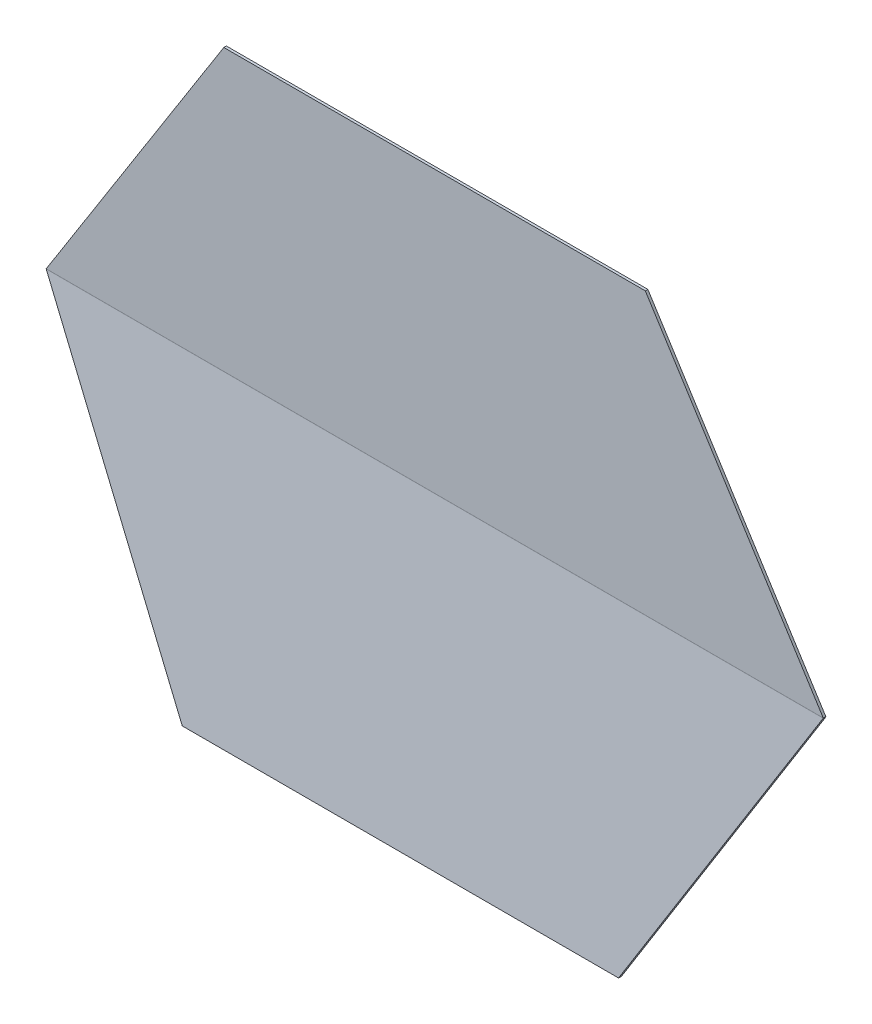
ISO-10303-21;
HEADER;
FILE_DESCRIPTION(('STEP AP214'),'2;1');
FILE_NAME('part.step','',(''),(''),'','','');
FILE_SCHEMA(('AUTOMOTIVE_DESIGN { 1 0 10303 214 1 1 1 1 }'));
ENDSEC;
DATA;
#1=APPLICATION_CONTEXT('core data for automotive mechanical design processes');
#2=APPLICATION_PROTOCOL_DEFINITION('international standard','automotive_design',2000,#1);
#3=PRODUCT_CONTEXT('',#1,'mechanical');
#4=PRODUCT('Part','Part','',(#3));
#5=PRODUCT_RELATED_PRODUCT_CATEGORY('part','',(#4));
#6=PRODUCT_DEFINITION_FORMATION('','',#4);
#7=PRODUCT_DEFINITION_CONTEXT('part definition',#1,'design');
#8=PRODUCT_DEFINITION('design','',#6,#7);
#9=PRODUCT_DEFINITION_SHAPE('','',#8);
#10=(LENGTH_UNIT() NAMED_UNIT(*) SI_UNIT(.MILLI.,.METRE.));
#11=(NAMED_UNIT(*) PLANE_ANGLE_UNIT() SI_UNIT($,.RADIAN.));
#12=(NAMED_UNIT(*) SI_UNIT($,.STERADIAN.) SOLID_ANGLE_UNIT());
#13=UNCERTAINTY_MEASURE_WITH_UNIT(LENGTH_MEASURE(1.E-05),#10,'distance_accuracy_value','');
#14=(GEOMETRIC_REPRESENTATION_CONTEXT(3) GLOBAL_UNCERTAINTY_ASSIGNED_CONTEXT((#13)) GLOBAL_UNIT_ASSIGNED_CONTEXT((#10,
#11,#12)) REPRESENTATION_CONTEXT('',''));
#15=CARTESIAN_POINT('',(0.,0.,0.));
#16=DIRECTION('',(0.,0.,1.));
#17=DIRECTION('',(1.,0.,0.));
#18=AXIS2_PLACEMENT_3D('',#15,#16,#17);
#19=CARTESIAN_POINT('',(0.0004041609394678,0.595540338395725,10.1778937181817));
#20=DIRECTION('',(7.91780855342487E-05,0.1166707102324,0.993170649538486));
#21=DIRECTION('',(0.999999996854675,-4.63470775884719E-06,-7.91780855342487E-05));
#22=AXIS2_PLACEMENT_3D('',#19,#20,#21);
#23=PLANE('',#22);
#24=DIRECTION('',(0.500004012201997,-0.86011333287123,0.101000209896064));
#25=VECTOR('',#24,1.);
#26=CARTESIAN_POINT('',(-289.380355220738,103.550819568525,-1.89349898860749));
#27=LINE('',#26,#25);
#28=CARTESIAN_POINT('',(-289.323398178921,103.452841332607,-1.88199373457318));
#29=VERTEX_POINT('',#28);
#30=CARTESIAN_POINT('',(-162.297482260204,-115.05877304566,23.7770887066437));
#31=VERTEX_POINT('',#30);
#32=EDGE_CURVE('E128',#29,#31,#27,.T.);
#33=ORIENTED_EDGE('',*,*,#32,.F.);
#34=DIRECTION('',(0.99999976972003,-0.000678645627025191,0.));
#35=VECTOR('',#34,1.);
#36=CARTESIAN_POINT('',(0.0700745514546838,103.256445672623,-1.88199373457316));
#37=LINE('',#36,#35);
#38=CARTESIAN_POINT('',(289.572156424681,103.059976305502,-1.88199373457316));
#39=VERTEX_POINT('',#38);
#40=EDGE_CURVE('E119',#29,#39,#37,.T.);
#41=ORIENTED_EDGE('',*,*,#40,.T.);
#42=DIRECTION('',(0.49999598465268,0.860108698163472,-0.101079387981598));
#43=VECTOR('',#42,1.);
#44=CARTESIAN_POINT('',(162.700943957801,-115.18784315471,23.7663412566442));
#45=LINE('',#44,#43);
#46=CARTESIAN_POINT('',(162.700943957801,-115.18784315471,23.7663412566442));
#47=VERTEX_POINT('',#46);
#48=EDGE_CURVE('E141',#47,#39,#45,.T.);
#49=ORIENTED_EDGE('',*,*,#48,.F.);
#50=DIRECTION('',(0.999999920592847,-0.000397140688658457,-3.3069234430395E-05));
#51=VECTOR('',#50,1.);
#52=CARTESIAN_POINT('',(162.700943957801,-115.18784315471,23.7663412566442));
#53=LINE('',#52,#51);
#54=EDGE_CURVE('E118',#31,#47,#53,.T.);
#55=ORIENTED_EDGE('',*,*,#54,.F.);
#56=EDGE_LOOP('',(#33,#41,#49,#55));
#57=FACE_BOUND('',#56,.T.);
#58=ADVANCED_FACE('F73',(#57),#23,.F.);
#59=CARTESIAN_POINT('',(162.700943957801,-115.18784315471,23.7663412566442));
#60=DIRECTION('',(0.866027718414386,-0.496589340116565,0.0582667848827042));
#61=DIRECTION('',(0.49999598465268,0.860108698163472,-0.101079387981598));
#62=AXIS2_PLACEMENT_3D('',#59,#60,#61);
#63=PLANE('',#62);
#64=CARTESIAN_POINT('',(289.572306863043,103.281650654943,0.00503049954995289));
#65=CARTESIAN_POINT('',(289.572156424681,103.059976305502,-1.88199373457317));
#66=B_SPLINE_CURVE_WITH_KNOTS('',1,(#64,#65),.UNSPECIFIED.,.F.,.F.,(2,2),(0.,1.),.UNSPECIFIED.);
#67=CARTESIAN_POINT('',(289.572306863044,103.281650654943,0.00503049954995278));
#68=VERTEX_POINT('',#67);
#69=EDGE_CURVE('E12',#68,#39,#66,.T.);
#70=ORIENTED_EDGE('',*,*,#69,.F.);
#71=DIRECTION('',(0.49999598465268,0.860108698163472,-0.101079387981598));
#72=VECTOR('',#71,1.);
#73=CARTESIAN_POINT('',(162.701094396164,-114.966168805269,25.6533654907673));
#74=LINE('',#73,#72);
#75=CARTESIAN_POINT('',(162.701094396164,-114.966168805269,25.6533654907673));
#76=VERTEX_POINT('',#75);
#77=EDGE_CURVE('E124',#76,#68,#74,.T.);
#78=ORIENTED_EDGE('',*,*,#77,.F.);
#79=DIRECTION('',(7.91780855342487E-05,0.1166707102324,0.993170649538486));
#80=VECTOR('',#79,1.);
#81=CARTESIAN_POINT('',(162.700943957801,-115.18784315471,23.7663412566442));
#82=LINE('',#81,#80);
#83=EDGE_CURVE('E100',#47,#76,#82,.T.);
#84=ORIENTED_EDGE('',*,*,#83,.F.);
#85=ORIENTED_EDGE('',*,*,#48,.T.);
#86=EDGE_LOOP('',(#70,#78,#84,#85));
#87=FACE_BOUND('',#86,.T.);
#88=ADVANCED_FACE('F75',(#87),#63,.T.);
#89=CARTESIAN_POINT('',(162.700943957801,-115.18784315471,23.7663412566442));
#90=DIRECTION('',(-0.000390570264645245,-0.99317057329199,0.11667073241275));
#91=DIRECTION('',(0.999999920592847,-0.000397140688658457,-3.3069234430395E-05));
#92=AXIS2_PLACEMENT_3D('',#89,#90,#91);
#93=PLANE('',#92);
#94=DIRECTION('',(0.999999920592847,-0.000397140688658457,-3.3069234430395E-05));
#95=VECTOR('',#94,1.);
#96=CARTESIAN_POINT('',(162.701094396164,-114.966168805269,25.6533654907673));
#97=LINE('',#96,#95);
#98=CARTESIAN_POINT('',(-162.297331821841,-114.837098696219,25.6641129407668));
#99=VERTEX_POINT('',#98);
#100=EDGE_CURVE('E116',#99,#76,#97,.T.);
#101=ORIENTED_EDGE('',*,*,#100,.F.);
#102=DIRECTION('',(7.91780855342487E-05,0.1166707102324,0.993170649538486));
#103=VECTOR('',#102,1.);
#104=CARTESIAN_POINT('',(-162.297482260204,-115.05877304566,23.7770887066437));
#105=LINE('',#104,#103);
#106=EDGE_CURVE('E120',#31,#99,#105,.T.);
#107=ORIENTED_EDGE('',*,*,#106,.F.);
#108=ORIENTED_EDGE('',*,*,#54,.T.);
#109=ORIENTED_EDGE('',*,*,#83,.T.);
#110=EDGE_LOOP('',(#101,#107,#108,#109));
#111=FACE_BOUND('',#110,.T.);
#112=ADVANCED_FACE('F113',(#111),#93,.T.);
#113=CARTESIAN_POINT('',(-289.380355220738,103.550819568525,-1.89349898860749));
#114=DIRECTION('',(-0.866023083706628,-0.496581312567248,0.0584039253496956));
#115=DIRECTION('',(0.500004012201997,-0.860113332871231,0.101000209896064));
#116=AXIS2_PLACEMENT_3D('',#113,#114,#115);
#117=PLANE('',#116);
#118=CARTESIAN_POINT('',(-289.323398178921,103.452841332607,-1.88199373457318));
#119=CARTESIAN_POINT('',(-289.323247740559,103.674515682048,0.00503049954995007));
#120=B_SPLINE_CURVE_WITH_KNOTS('',1,(#118,#119),.UNSPECIFIED.,.F.,.F.,(2,2),(0.,1.),.UNSPECIFIED.);
#121=CARTESIAN_POINT('',(-289.323247740559,103.674515682048,0.00503049954994996));
#122=VERTEX_POINT('',#121);
#123=EDGE_CURVE('E144',#29,#122,#120,.T.);
#124=ORIENTED_EDGE('',*,*,#123,.F.);
#125=ORIENTED_EDGE('',*,*,#32,.T.);
#126=ORIENTED_EDGE('',*,*,#106,.T.);
#127=DIRECTION('',(0.500004012201997,-0.86011333287123,0.101000209896064));
#128=VECTOR('',#127,1.);
#129=CARTESIAN_POINT('',(-289.380204782376,103.772493917967,-0.00647475448436324));
#130=LINE('',#129,#128);
#131=EDGE_CURVE('E132',#122,#99,#130,.T.);
#132=ORIENTED_EDGE('',*,*,#131,.F.);
#133=EDGE_LOOP('',(#124,#125,#126,#132));
#134=FACE_BOUND('',#133,.T.);
#135=ADVANCED_FACE('F162',(#134),#117,.T.);
#136=CARTESIAN_POINT('',(0.000554599301982872,0.817214687837284,12.0649179523048));
#137=DIRECTION('',(7.91780855342487E-05,0.1166707102324,0.993170649538486));
#138=DIRECTION('',(0.999999996854675,-4.63470775884719E-06,-7.91780855342487E-05));
#139=AXIS2_PLACEMENT_3D('',#136,#137,#138);
#140=PLANE('',#139);
#141=DIRECTION('',(0.99999976972003,-0.000678645627025191,0.));
#142=VECTOR('',#141,1.);
#143=CARTESIAN_POINT('',(0.0702249898171989,103.478120022064,0.00503049954996178));
#144=LINE('',#143,#142);
#145=EDGE_CURVE('E84',#122,#68,#144,.T.);
#146=ORIENTED_EDGE('',*,*,#145,.F.);
#147=ORIENTED_EDGE('',*,*,#131,.T.);
#148=ORIENTED_EDGE('',*,*,#100,.T.);
#149=ORIENTED_EDGE('',*,*,#77,.T.);
#150=EDGE_LOOP('',(#146,#147,#148,#149));
#151=FACE_BOUND('',#150,.T.);
#152=ADVANCED_FACE('F130',(#151),#140,.T.);
#153=CARTESIAN_POINT('',(-156.989471165865,312.7,-1.9));
#154=DIRECTION('',(0.,1.,0.));
#155=DIRECTION('',(0.,0.,1.));
#156=AXIS2_PLACEMENT_3D('',#153,#154,#155);
#157=PLANE('',#156);
#158=DIRECTION('',(-1.,0.,0.));
#159=VECTOR('',#158,1.);
#160=CARTESIAN_POINT('',(-156.989471165865,312.7,0.));
#161=LINE('',#160,#159);
#162=CARTESIAN_POINT('',(156.989471165865,312.7,0.));
#163=VERTEX_POINT('',#162);
#164=CARTESIAN_POINT('',(-156.989471165865,312.7,0.));
#165=VERTEX_POINT('',#164);
#166=EDGE_CURVE('E591',#163,#165,#161,.T.);
#167=ORIENTED_EDGE('',*,*,#166,.F.);
#168=DIRECTION('',(0.,0.,1.));
#169=VECTOR('',#168,1.);
#170=CARTESIAN_POINT('',(156.989471165865,312.7,-1.9));
#171=LINE('',#170,#169);
#172=CARTESIAN_POINT('',(156.989471165865,312.7,-1.9));
#173=VERTEX_POINT('',#172);
#174=EDGE_CURVE('E135',#173,#163,#171,.T.);
#175=ORIENTED_EDGE('',*,*,#174,.F.);
#176=DIRECTION('',(-1.,0.,0.));
#177=VECTOR('',#176,1.);
#178=CARTESIAN_POINT('',(-156.989471165865,312.7,-1.9));
#179=LINE('',#178,#177);
#180=CARTESIAN_POINT('',(-156.989471165865,312.7,-1.9));
#181=VERTEX_POINT('',#180);
#182=EDGE_CURVE('E344',#173,#181,#179,.T.);
#183=ORIENTED_EDGE('',*,*,#182,.T.);
#184=DIRECTION('',(0.,0.,1.));
#185=VECTOR('',#184,1.);
#186=CARTESIAN_POINT('',(-156.989471165865,312.7,-1.9));
#187=LINE('',#186,#185);
#188=EDGE_CURVE('E387',#181,#165,#187,.T.);
#189=ORIENTED_EDGE('',*,*,#188,.T.);
#190=EDGE_LOOP('',(#167,#175,#183,#189));
#191=FACE_BOUND('',#190,.T.);
#192=ADVANCED_FACE('F173',(#191),#157,.T.);
#193=CARTESIAN_POINT('',(0.,0.,-1.9));
#194=DIRECTION('',(0.,0.,1.));
#195=DIRECTION('',(1.,0.,0.));
#196=AXIS2_PLACEMENT_3D('',#193,#194,#195);
#197=PLANE('',#196);
#198=DIRECTION('',(0.99999976972003,-0.000678645627025023,0.));
#199=VECTOR('',#198,1.);
#200=CARTESIAN_POINT('',(0.0702833123949575,103.564059667222,-1.9));
#201=LINE('',#200,#199);
#202=CARTESIAN_POINT('',(-289.317851752811,103.760451704822,-1.9));
#203=VERTEX_POINT('',#202);
#204=CARTESIAN_POINT('',(289.566661524316,103.367594170866,-1.9));
#205=VERTEX_POINT('',#204);
#206=EDGE_CURVE('E341',#203,#205,#201,.T.);
#207=ORIENTED_EDGE('',*,*,#206,.F.);
#208=DIRECTION('',(-0.535052081184343,-0.84481907555423,0.));
#209=VECTOR('',#208,1.);
#210=CARTESIAN_POINT('',(-289.380279849348,103.661881026078,-1.9));
#211=LINE('',#210,#209);
#212=EDGE_CURVE('E374',#181,#203,#211,.T.);
#213=ORIENTED_EDGE('',*,*,#212,.F.);
#214=ORIENTED_EDGE('',*,*,#182,.F.);
#215=DIRECTION('',(-0.535052081184344,0.844819075554229,0.));
#216=VECTOR('',#215,1.);
#217=CARTESIAN_POINT('',(156.989471165865,312.7,-1.9));
#218=LINE('',#217,#216);
#219=EDGE_CURVE('E377',#205,#173,#218,.T.);
#220=ORIENTED_EDGE('',*,*,#219,.F.);
#221=EDGE_LOOP('',(#207,#213,#214,#220));
#222=FACE_BOUND('',#221,.T.);
#223=ADVANCED_FACE('F177',(#222),#197,.F.);
#224=CARTESIAN_POINT('',(-289.380279849348,103.661881026078,-1.9));
#225=DIRECTION('',(-0.84481907555423,0.535052081184343,0.));
#226=DIRECTION('',(-0.535052081184343,-0.84481907555423,0.));
#227=AXIS2_PLACEMENT_3D('',#224,#225,#226);
#228=PLANE('',#227);
#229=ORIENTED_EDGE('',*,*,#212,.T.);
#230=CARTESIAN_POINT('',(-289.317851752811,103.760451704822,0.));
#231=CARTESIAN_POINT('',(-289.317851752811,103.760451704822,-1.9));
#232=B_SPLINE_CURVE_WITH_KNOTS('',1,(#230,#231),.UNSPECIFIED.,.F.,.F.,(2,2),(0.,1.),.UNSPECIFIED.);
#233=CARTESIAN_POINT('',(-289.317851752811,103.760451704822,0.));
#234=VERTEX_POINT('',#233);
#235=EDGE_CURVE('E384',#203,#234,#232,.F.);
#236=ORIENTED_EDGE('',*,*,#235,.T.);
#237=DIRECTION('',(-0.535052081184343,-0.84481907555423,0.));
#238=VECTOR('',#237,1.);
#239=CARTESIAN_POINT('',(-289.380279849348,103.661881026078,0.));
#240=LINE('',#239,#238);
#241=EDGE_CURVE('E389',#165,#234,#240,.T.);
#242=ORIENTED_EDGE('',*,*,#241,.F.);
#243=ORIENTED_EDGE('',*,*,#188,.F.);
#244=EDGE_LOOP('',(#229,#236,#242,#243));
#245=FACE_BOUND('',#244,.T.);
#246=ADVANCED_FACE('F382',(#245),#228,.T.);
#247=CARTESIAN_POINT('',(0.,0.,0.));
#248=DIRECTION('',(0.,0.,1.));
#249=DIRECTION('',(1.,0.,0.));
#250=AXIS2_PLACEMENT_3D('',#247,#248,#249);
#251=PLANE('',#250);
#252=ORIENTED_EDGE('',*,*,#241,.T.);
#253=DIRECTION('',(0.99999976972003,-0.000678645627025023,0.));
#254=VECTOR('',#253,1.);
#255=CARTESIAN_POINT('',(0.0702833123949575,103.564059667222,0.));
#256=LINE('',#255,#254);
#257=CARTESIAN_POINT('',(289.566661524316,103.367594170866,0.));
#258=VERTEX_POINT('',#257);
#259=EDGE_CURVE('E594',#234,#258,#256,.T.);
#260=ORIENTED_EDGE('',*,*,#259,.T.);
#261=DIRECTION('',(-0.535052081184344,0.844819075554229,0.));
#262=VECTOR('',#261,1.);
#263=CARTESIAN_POINT('',(156.989471165865,312.7,0.));
#264=LINE('',#263,#262);
#265=EDGE_CURVE('E408',#258,#163,#264,.T.);
#266=ORIENTED_EDGE('',*,*,#265,.T.);
#267=ORIENTED_EDGE('',*,*,#166,.T.);
#268=EDGE_LOOP('',(#252,#260,#266,#267));
#269=FACE_BOUND('',#268,.T.);
#270=ADVANCED_FACE('F417',(#269),#251,.T.);
#271=CARTESIAN_POINT('',(156.989471165865,312.7,-1.9));
#272=DIRECTION('',(0.844819075554229,0.535052081184344,0.));
#273=DIRECTION('',(-0.535052081184344,0.844819075554229,0.));
#274=AXIS2_PLACEMENT_3D('',#271,#272,#273);
#275=PLANE('',#274);
#276=ORIENTED_EDGE('',*,*,#265,.F.);
#277=CARTESIAN_POINT('',(289.566661524316,103.367594170866,-1.9));
#278=CARTESIAN_POINT('',(289.566661524316,103.367594170866,0.));
#279=B_SPLINE_CURVE_WITH_KNOTS('',1,(#277,#278),.UNSPECIFIED.,.F.,.F.,(2,2),(0.,1.),.UNSPECIFIED.);
#280=EDGE_CURVE('E397',#258,#205,#279,.F.);
#281=ORIENTED_EDGE('',*,*,#280,.T.);
#282=ORIENTED_EDGE('',*,*,#219,.T.);
#283=ORIENTED_EDGE('',*,*,#174,.T.);
#284=EDGE_LOOP('',(#276,#281,#282,#283));
#285=FACE_BOUND('',#284,.T.);
#286=ADVANCED_FACE('F294',(#285),#275,.T.);
#287=CARTESIAN_POINT('',(-289.380317485192,103.606423753757,-1.89549458422144));
#288=CARTESIAN_POINT('',(-289.359495607728,103.657707884316,-1.89849733994322));
#289=CARTESIAN_POINT('',(-289.338673689866,103.70907976591,-1.9));
#290=CARTESIAN_POINT('',(-289.317851752811,103.760451704822,-1.9));
#291=CARTESIAN_POINT('',(-289.380242137257,103.717450650974,0.00125870031953594));
#292=CARTESIAN_POINT('',(-289.359445351132,103.731767983881,0.000419805742691216));
#293=CARTESIAN_POINT('',(-289.338648555583,103.746109840465,0.));
#294=CARTESIAN_POINT('',(-289.317851752811,103.760451704822,0.));
#295=B_SPLINE_SURFACE_WITH_KNOTS('',1,3,((#287,#288,#289,#290),(#291,#292,#293,#294)),
.UNSPECIFIED.,.F.,.F.,.F.,(2,2),(4,4),(0.,1.),(0.,1.),.UNSPECIFIED.);
#296=CARTESIAN_POINT('',(-289.380242137257,103.717450650974,0.00125870031953594));
#297=CARTESIAN_POINT('',(-289.380317485192,103.606423753757,-1.89549458422144));
#298=B_SPLINE_CURVE_WITH_KNOTS('',1,(#296,#297),.UNSPECIFIED.,.F.,.F.,(2,2),(0.,1.),.UNSPECIFIED.);
#299=CARTESIAN_POINT('',(-289.380242137257,103.717450650974,0.00125870031953594));
#300=VERTEX_POINT('',#299);
#301=CARTESIAN_POINT('',(-289.380317485192,103.606423753757,-1.89549458422144));
#302=VERTEX_POINT('',#301);
#303=EDGE_CURVE('E323',#300,#302,#298,.T.);
#304=CARTESIAN_POINT('',(-289.380242137257,103.717450650974,0.00125870031953594));
#305=CARTESIAN_POINT('',(-289.359445351132,103.731767983881,0.000419805742691216));
#306=CARTESIAN_POINT('',(-289.338648555583,103.746109840465,0.));
#307=CARTESIAN_POINT('',(-289.317851752811,103.760451704822,0.));
#308=B_SPLINE_CURVE_WITH_KNOTS('',3,(#304,#305,#306,#307),.UNSPECIFIED.,.F.,.F.,(4,4),(0.,1.),.UNSPECIFIED.);
#309=EDGE_CURVE('E222',#300,#234,#308,.T.);
#310=CARTESIAN_POINT('',(-289.317851752811,103.760451704822,-1.9));
#311=CARTESIAN_POINT('',(-289.338673689866,103.70907976591,-1.9));
#312=CARTESIAN_POINT('',(-289.359495607728,103.657707884316,-1.89849733994322));
#313=CARTESIAN_POINT('',(-289.380317485192,103.606423753757,-1.89549458422144));
#314=B_SPLINE_CURVE_WITH_KNOTS('',3,(#310,#311,#312,#313),.UNSPECIFIED.,.F.,.F.,(4,4),(0.,1.),.UNSPECIFIED.);
#315=EDGE_CURVE('E224',#302,#203,#314,.F.);
#316=ORIENTED_EDGE('',*,*,#303,.F.);
#317=ORIENTED_EDGE('',*,*,#309,.T.);
#318=ORIENTED_EDGE('',*,*,#235,.F.);
#319=ORIENTED_EDGE('',*,*,#315,.F.);
#320=EDGE_LOOP('',(#316,#317,#318,#319));
#321=FACE_BOUND('',#320,.T.);
#322=ADVANCED_FACE('F282',(#321),#295,.T.);
#323=CARTESIAN_POINT('',(289.566661524316,103.367594170866,-1.9));
#324=CARTESIAN_POINT('',(289.587476226866,103.316193975438,-1.9));
#325=CARTESIAN_POINT('',(289.608290910259,103.264793837313,-1.89849733994244));
#326=CARTESIAN_POINT('',(289.6291056724,103.213481450238,-1.89549458422143));
#327=CARTESIAN_POINT('',(289.566661524316,103.367594170866,0.));
#328=CARTESIAN_POINT('',(289.587501353175,103.353224049992,0.));
#329=CARTESIAN_POINT('',(289.608341174828,103.33885393688,0.000419805743087268));
#330=CARTESIAN_POINT('',(289.629181020335,103.324508347455,0.00125870031953703));
#331=B_SPLINE_SURFACE_WITH_KNOTS('',1,3,((#323,#324,#325,#326),(#327,#328,#329,#330)),
.UNSPECIFIED.,.F.,.F.,.F.,(2,2),(4,4),(0.,1.),(0.,1.),.UNSPECIFIED.);
#332=CARTESIAN_POINT('',(289.566661524316,103.367594170866,0.));
#333=CARTESIAN_POINT('',(289.587501353175,103.353224049992,0.));
#334=CARTESIAN_POINT('',(289.608341174828,103.33885393688,0.000419805743087268));
#335=CARTESIAN_POINT('',(289.629181020335,103.324508347455,0.00125870031953703));
#336=B_SPLINE_CURVE_WITH_KNOTS('',3,(#332,#333,#334,#335),.UNSPECIFIED.,.F.,.F.,(4,4),(0.,1.),.UNSPECIFIED.);
#337=CARTESIAN_POINT('',(289.629181020335,103.324508347455,0.00125870031953725));
#338=VERTEX_POINT('',#337);
#339=EDGE_CURVE('E549',#258,#338,#336,.T.);
#340=CARTESIAN_POINT('',(289.629181020335,103.324508347455,0.00125870031953703));
#341=CARTESIAN_POINT('',(289.6291056724,103.213481450238,-1.89549458422143));
#342=B_SPLINE_CURVE_WITH_KNOTS('',1,(#340,#341),.UNSPECIFIED.,.F.,.F.,(2,2),(0.,1.),.UNSPECIFIED.);
#343=CARTESIAN_POINT('',(289.6291056724,103.213481450238,-1.89549458422143));
#344=VERTEX_POINT('',#343);
#345=EDGE_CURVE('E342',#338,#344,#342,.T.);
#346=CARTESIAN_POINT('',(289.6291056724,103.213481450238,-1.89549458422143));
#347=CARTESIAN_POINT('',(289.608290910259,103.264793837313,-1.89849733994244));
#348=CARTESIAN_POINT('',(289.587476226866,103.316193975438,-1.9));
#349=CARTESIAN_POINT('',(289.566661524316,103.367594170866,-1.9));
#350=B_SPLINE_CURVE_WITH_KNOTS('',3,(#346,#347,#348,#349),.UNSPECIFIED.,.F.,.F.,(4,4),(0.,1.),.UNSPECIFIED.);
#351=EDGE_CURVE('E356',#205,#344,#350,.F.);
#352=ORIENTED_EDGE('',*,*,#280,.F.);
#353=ORIENTED_EDGE('',*,*,#339,.T.);
#354=ORIENTED_EDGE('',*,*,#345,.T.);
#355=ORIENTED_EDGE('',*,*,#351,.F.);
#356=EDGE_LOOP('',(#352,#353,#354,#355));
#357=FACE_BOUND('',#356,.T.);
#358=ADVANCED_FACE('F293',(#357),#331,.T.);
#359=CARTESIAN_POINT('',(289.6291056724,103.213481450238,-1.89549458422143));
#360=CARTESIAN_POINT('',(289.610122504466,103.162196071464,-1.8924918284773));
#361=CARTESIAN_POINT('',(289.591139414046,103.110998559309,-1.88798898385775));
#362=CARTESIAN_POINT('',(289.572156424681,103.059976305502,-1.88199373457317));
#363=CARTESIAN_POINT('',(289.629181020335,103.324508347455,0.00125870031953725));
#364=CARTESIAN_POINT('',(289.610222943248,103.310189766502,0.00209759490890152));
#365=CARTESIAN_POINT('',(289.591264890243,103.295895725385,0.00335557737337068));
#366=CARTESIAN_POINT('',(289.572306863043,103.281650654943,0.00503049954995289));
#367=B_SPLINE_SURFACE_WITH_KNOTS('',1,3,((#359,#360,#361,#362),(#363,#364,#365,#366)),
.UNSPECIFIED.,.F.,.F.,.F.,(2,2),(4,4),(0.,1.),(0.,1.),.UNSPECIFIED.);
#368=CARTESIAN_POINT('',(289.629181020335,103.324508347455,0.00125870031953725));
#369=CARTESIAN_POINT('',(289.610222943248,103.310189766502,0.00209759490890152));
#370=CARTESIAN_POINT('',(289.591264890243,103.295895725385,0.00335557737337068));
#371=CARTESIAN_POINT('',(289.572306863043,103.281650654943,0.00503049954995289));
#372=B_SPLINE_CURVE_WITH_KNOTS('',3,(#368,#369,#370,#371),.UNSPECIFIED.,.F.,.F.,(4,4),(0.,1.),.UNSPECIFIED.);
#373=EDGE_CURVE('E225',#338,#68,#372,.T.);
#374=CARTESIAN_POINT('',(289.572156424681,103.059976305502,-1.88199373457317));
#375=CARTESIAN_POINT('',(289.591139414046,103.110998559309,-1.88798898385775));
#376=CARTESIAN_POINT('',(289.610122504466,103.162196071464,-1.8924918284773));
#377=CARTESIAN_POINT('',(289.6291056724,103.213481450238,-1.89549458422143));
#378=B_SPLINE_CURVE_WITH_KNOTS('',3,(#374,#375,#376,#377),.UNSPECIFIED.,.F.,.F.,(4,4),(0.,1.),.UNSPECIFIED.);
#379=EDGE_CURVE('E91',#344,#39,#378,.F.);
#380=ORIENTED_EDGE('',*,*,#345,.F.);
#381=ORIENTED_EDGE('',*,*,#373,.T.);
#382=ORIENTED_EDGE('',*,*,#69,.T.);
#383=ORIENTED_EDGE('',*,*,#379,.F.);
#384=EDGE_LOOP('',(#380,#381,#382,#383));
#385=FACE_BOUND('',#384,.T.);
#386=ADVANCED_FACE('F245',(#385),#367,.T.);
#387=CARTESIAN_POINT('',(-289.323398178921,103.452841332607,-1.88199373457318));
#388=CARTESIAN_POINT('',(-289.342371386156,103.503889345215,-1.88798898385632));
#389=CARTESIAN_POINT('',(-289.361344456526,103.555112616183,-1.89249182847803));
#390=CARTESIAN_POINT('',(-289.380317485192,103.606423753757,-1.89549458422144));
#391=CARTESIAN_POINT('',(-289.323247740559,103.674515682048,0.00503049954995007));
#392=CARTESIAN_POINT('',(-289.342245902972,103.688786511291,0.0033555773742632));
#393=CARTESIAN_POINT('',(-289.361244024731,103.70310631122,0.00209759490845635));
#394=CARTESIAN_POINT('',(-289.380242137257,103.717450650974,0.00125870031953594));
#395=B_SPLINE_SURFACE_WITH_KNOTS('',1,3,((#387,#388,#389,#390),(#391,#392,#393,#394)),
.UNSPECIFIED.,.F.,.F.,.F.,(2,2),(4,4),(0.,1.),(0.,1.),.UNSPECIFIED.);
#396=CARTESIAN_POINT('',(-289.323247740559,103.674515682048,0.00503049954995007));
#397=CARTESIAN_POINT('',(-289.342245902972,103.688786511291,0.0033555773742632));
#398=CARTESIAN_POINT('',(-289.361244024731,103.70310631122,0.00209759490845635));
#399=CARTESIAN_POINT('',(-289.380242137257,103.717450650974,0.00125870031953594));
#400=B_SPLINE_CURVE_WITH_KNOTS('',3,(#396,#397,#398,#399),.UNSPECIFIED.,.F.,.F.,(4,4),(0.,1.),.UNSPECIFIED.);
#401=EDGE_CURVE('E210',#122,#300,#400,.T.);
#402=CARTESIAN_POINT('',(-289.380317485192,103.606423753757,-1.89549458422144));
#403=CARTESIAN_POINT('',(-289.361344456526,103.555112616183,-1.89249182847803));
#404=CARTESIAN_POINT('',(-289.342371386156,103.503889345215,-1.88798898385632));
#405=CARTESIAN_POINT('',(-289.323398178921,103.452841332607,-1.88199373457318));
#406=B_SPLINE_CURVE_WITH_KNOTS('',3,(#402,#403,#404,#405),.UNSPECIFIED.,.F.,.F.,(4,4),(0.,1.),.UNSPECIFIED.);
#407=EDGE_CURVE('E213',#29,#302,#406,.F.);
#408=ORIENTED_EDGE('',*,*,#401,.T.);
#409=ORIENTED_EDGE('',*,*,#303,.T.);
#410=ORIENTED_EDGE('',*,*,#407,.F.);
#411=ORIENTED_EDGE('',*,*,#123,.T.);
#412=EDGE_LOOP('',(#408,#409,#410,#411));
#413=FACE_BOUND('',#412,.T.);
#414=ADVANCED_FACE('F207',(#413),#395,.T.);
#415=CARTESIAN_POINT('',(579.137112779998,103.171078405152,0.7366));
#416=DIRECTION('',(-0.99999976972003,0.000678645627025023,0.));
#417=DIRECTION('',(-0.000678645627025023,-0.99999976972003,0.));
#418=AXIS2_PLACEMENT_3D('',#415,#416,#417);
#419=CYLINDRICAL_SURFACE('',#418,2.6366);
#420=ORIENTED_EDGE('',*,*,#40,.F.);
#421=ORIENTED_EDGE('',*,*,#407,.T.);
#422=ORIENTED_EDGE('',*,*,#315,.T.);
#423=ORIENTED_EDGE('',*,*,#206,.T.);
#424=ORIENTED_EDGE('',*,*,#351,.T.);
#425=ORIENTED_EDGE('',*,*,#379,.T.);
#426=EDGE_LOOP('',(#420,#421,#422,#423,#424,#425));
#427=FACE_BOUND('',#426,.T.);
#428=ADVANCED_FACE('F243',(#427),#419,.T.);
#429=CARTESIAN_POINT('',(579.137112779998,103.171078405152,0.7366));
#430=DIRECTION('',(-0.99999976972003,0.000678645627025023,0.));
#431=DIRECTION('',(-0.000678645627025023,-0.99999976972003,0.));
#432=AXIS2_PLACEMENT_3D('',#429,#430,#431);
#433=CYLINDRICAL_SURFACE('',#432,0.7366);
#434=ORIENTED_EDGE('',*,*,#145,.T.);
#435=ORIENTED_EDGE('',*,*,#373,.F.);
#436=ORIENTED_EDGE('',*,*,#339,.F.);
#437=ORIENTED_EDGE('',*,*,#259,.F.);
#438=ORIENTED_EDGE('',*,*,#309,.F.);
#439=ORIENTED_EDGE('',*,*,#401,.F.);
#440=EDGE_LOOP('',(#434,#435,#436,#437,#438,#439));
#441=FACE_BOUND('',#440,.T.);
#442=ADVANCED_FACE('F219',(#441),#433,.F.);
#443=CLOSED_SHELL('',(#58,#88,#112,#135,#152,#192,#223,#246,#270,#286,#322,#358,#386,#414,#428,#442));
#444=MANIFOLD_SOLID_BREP('B2',#443);
#445=ADVANCED_BREP_SHAPE_REPRESENTATION('',(#18,#444),#14);
#446=SHAPE_DEFINITION_REPRESENTATION(#9,#445);
ENDSEC;
END-ISO-10303-21;
